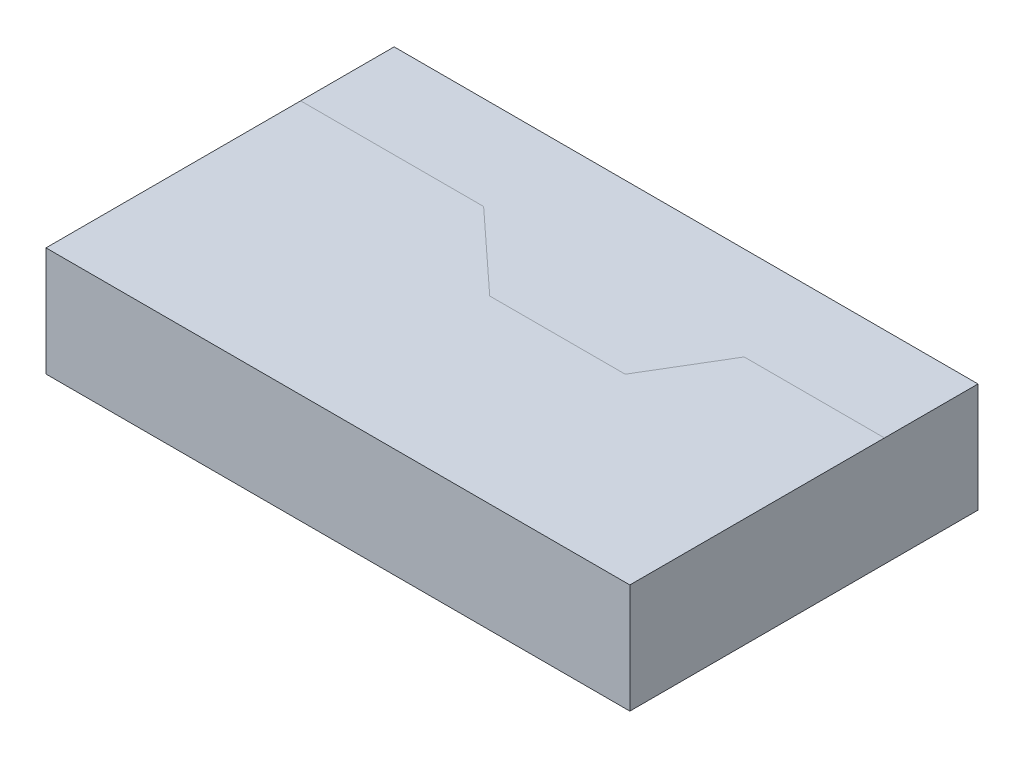
ISO-10303-21;
HEADER;
FILE_DESCRIPTION(('STEP AP214'),'2;1');
FILE_NAME('part.step','',(''),(''),'','','');
FILE_SCHEMA(('AUTOMOTIVE_DESIGN { 1 0 10303 214 1 1 1 1 }'));
ENDSEC;
DATA;
#1=APPLICATION_CONTEXT('core data for automotive mechanical design processes');
#2=APPLICATION_PROTOCOL_DEFINITION('international standard','automotive_design',2000,#1);
#3=PRODUCT_CONTEXT('',#1,'mechanical');
#4=PRODUCT('Part','Part','',(#3));
#5=PRODUCT_RELATED_PRODUCT_CATEGORY('part','',(#4));
#6=PRODUCT_DEFINITION_FORMATION('','',#4);
#7=PRODUCT_DEFINITION_CONTEXT('part definition',#1,'design');
#8=PRODUCT_DEFINITION('design','',#6,#7);
#9=PRODUCT_DEFINITION_SHAPE('','',#8);
#10=(LENGTH_UNIT() NAMED_UNIT(*) SI_UNIT(.MILLI.,.METRE.));
#11=(NAMED_UNIT(*) PLANE_ANGLE_UNIT() SI_UNIT($,.RADIAN.));
#12=(NAMED_UNIT(*) SI_UNIT($,.STERADIAN.) SOLID_ANGLE_UNIT());
#13=UNCERTAINTY_MEASURE_WITH_UNIT(LENGTH_MEASURE(1.E-05),#10,'distance_accuracy_value','');
#14=(GEOMETRIC_REPRESENTATION_CONTEXT(3) GLOBAL_UNCERTAINTY_ASSIGNED_CONTEXT((#13)) GLOBAL_UNIT_ASSIGNED_CONTEXT((#10,
#11,#12)) REPRESENTATION_CONTEXT('',''));
#15=CARTESIAN_POINT('',(0.,0.,0.));
#16=DIRECTION('',(0.,0.,1.));
#17=DIRECTION('',(1.,0.,0.));
#18=AXIS2_PLACEMENT_3D('',#15,#16,#17);
#19=CARTESIAN_POINT('',(0.,0.,-80.9010250569476));
#20=DIRECTION('',(0.,-1.,0.));
#21=DIRECTION('',(0.,0.,-1.));
#22=AXIS2_PLACEMENT_3D('',#19,#20,#21);
#23=PLANE('',#22);
#24=DIRECTION('',(1.,0.,0.));
#25=VECTOR('',#24,1.);
#26=CARTESIAN_POINT('',(0.,0.,-59.1702292609045));
#27=LINE('',#26,#25);
#28=CARTESIAN_POINT('',(0.,0.,-59.1702292609045));
#29=VERTEX_POINT('',#28);
#30=CARTESIAN_POINT('',(42.5239207695656,0.,-59.1702292609045));
#31=VERTEX_POINT('',#30);
#32=EDGE_CURVE('E11',#29,#31,#27,.T.);
#33=ORIENTED_EDGE('',*,*,#32,.F.);
#34=DIRECTION('',(0.,0.,1.));
#35=VECTOR('',#34,1.);
#36=CARTESIAN_POINT('',(0.,0.,0.));
#37=LINE('',#36,#35);
#38=CARTESIAN_POINT('',(0.,0.,0.));
#39=VERTEX_POINT('',#38);
#40=EDGE_CURVE('E123',#29,#39,#37,.T.);
#41=ORIENTED_EDGE('',*,*,#40,.T.);
#42=DIRECTION('',(1.,0.,0.));
#43=VECTOR('',#42,1.);
#44=CARTESIAN_POINT('',(0.,0.,0.));
#45=LINE('',#44,#43);
#46=CARTESIAN_POINT('',(135.676166338205,0.,0.));
#47=VERTEX_POINT('',#46);
#48=EDGE_CURVE('E94',#39,#47,#45,.T.);
#49=ORIENTED_EDGE('',*,*,#48,.T.);
#50=DIRECTION('',(0.,0.,-1.));
#51=VECTOR('',#50,1.);
#52=CARTESIAN_POINT('',(135.676166338205,0.,0.));
#53=LINE('',#52,#51);
#54=CARTESIAN_POINT('',(135.676166338205,0.,-59.1702292609045));
#55=VERTEX_POINT('',#54);
#56=EDGE_CURVE('E116',#47,#55,#53,.T.);
#57=ORIENTED_EDGE('',*,*,#56,.T.);
#58=DIRECTION('',(1.,0.,0.));
#59=VECTOR('',#58,1.);
#60=CARTESIAN_POINT('',(0.,0.,-59.1702292609045));
#61=LINE('',#60,#59);
#62=CARTESIAN_POINT('',(103.079368078262,0.,-59.1702292609045));
#63=VERTEX_POINT('',#62);
#64=EDGE_CURVE('E129',#63,#55,#61,.T.);
#65=ORIENTED_EDGE('',*,*,#64,.F.);
#66=DIRECTION('',(0.513461011624656,0.,-0.858112923537097));
#67=VECTOR('',#66,1.);
#68=CARTESIAN_POINT('',(85.4780478818783,0.,-29.754324275168));
#69=LINE('',#68,#67);
#70=CARTESIAN_POINT('',(92.726797461084,0.,-41.8686728869914));
#71=VERTEX_POINT('',#70);
#72=EDGE_CURVE('E136',#71,#63,#69,.T.);
#73=ORIENTED_EDGE('',*,*,#72,.F.);
#74=DIRECTION('',(1.,0.,0.));
#75=VECTOR('',#74,1.);
#76=CARTESIAN_POINT('',(0.,0.,-41.8686728869914));
#77=LINE('',#76,#75);
#78=CARTESIAN_POINT('',(61.2436375019962,0.,-41.8686728869914));
#79=VERTEX_POINT('',#78);
#80=EDGE_CURVE('E139',#79,#71,#77,.T.);
#81=ORIENTED_EDGE('',*,*,#80,.F.);
#82=DIRECTION('',(0.734376708125109,0.,0.678742109024722));
#83=VECTOR('',#82,1.);
#84=CARTESIAN_POINT('',(8.75861400379892,0.,-90.3775582413858));
#85=LINE('',#84,#83);
#86=EDGE_CURVE('E42',#31,#79,#85,.T.);
#87=ORIENTED_EDGE('',*,*,#86,.F.);
#88=EDGE_LOOP('',(#33,#41,#49,#57,#65,#73,#81,#87));
#89=FACE_BOUND('',#88,.T.);
#90=ADVANCED_FACE('F33',(#89),#23,.F.);
#91=CARTESIAN_POINT('',(0.,-25.4,0.));
#92=DIRECTION('',(-1.,0.,0.));
#93=DIRECTION('',(0.,0.,1.));
#94=AXIS2_PLACEMENT_3D('',#91,#92,#93);
#95=PLANE('',#94);
#96=CARTESIAN_POINT('',(0.,0.,-80.9010250569476));
#97=VERTEX_POINT('',#96);
#98=EDGE_CURVE('E121',#97,#29,#37,.T.);
#99=ORIENTED_EDGE('',*,*,#98,.F.);
#100=DIRECTION('',(0.,1.,0.));
#101=VECTOR('',#100,1.);
#102=CARTESIAN_POINT('',(0.,-25.4,-80.9010250569476));
#103=LINE('',#102,#101);
#104=CARTESIAN_POINT('',(0.,-25.4,-80.9010250569476));
#105=VERTEX_POINT('',#104);
#106=EDGE_CURVE('E112',#105,#97,#103,.T.);
#107=ORIENTED_EDGE('',*,*,#106,.F.);
#108=DIRECTION('',(0.,0.,1.));
#109=VECTOR('',#108,1.);
#110=CARTESIAN_POINT('',(0.,-25.4,0.));
#111=LINE('',#110,#109);
#112=CARTESIAN_POINT('',(0.,-25.4,0.));
#113=VERTEX_POINT('',#112);
#114=EDGE_CURVE('E106',#105,#113,#111,.T.);
#115=ORIENTED_EDGE('',*,*,#114,.T.);
#116=DIRECTION('',(0.,1.,0.));
#117=VECTOR('',#116,1.);
#118=CARTESIAN_POINT('',(0.,-25.4,0.));
#119=LINE('',#118,#117);
#120=EDGE_CURVE('E89',#113,#39,#119,.T.);
#121=ORIENTED_EDGE('',*,*,#120,.T.);
#122=ORIENTED_EDGE('',*,*,#40,.F.);
#123=EDGE_LOOP('',(#99,#107,#115,#121,#122));
#124=FACE_BOUND('',#123,.T.);
#125=ADVANCED_FACE('F35',(#124),#95,.T.);
#126=CARTESIAN_POINT('',(0.,-25.4,-80.9010250569476));
#127=DIRECTION('',(0.,0.,-1.));
#128=DIRECTION('',(-1.,0.,0.));
#129=AXIS2_PLACEMENT_3D('',#126,#127,#128);
#130=PLANE('',#129);
#131=DIRECTION('',(-1.,0.,0.));
#132=VECTOR('',#131,1.);
#133=CARTESIAN_POINT('',(0.,0.,-80.9010250569476));
#134=LINE('',#133,#132);
#135=CARTESIAN_POINT('',(135.676166338205,0.,-80.9010250569476));
#136=VERTEX_POINT('',#135);
#137=EDGE_CURVE('E113',#136,#97,#134,.T.);
#138=ORIENTED_EDGE('',*,*,#137,.F.);
#139=DIRECTION('',(0.,1.,0.));
#140=VECTOR('',#139,1.);
#141=CARTESIAN_POINT('',(135.676166338205,-25.4,-80.9010250569476));
#142=LINE('',#141,#140);
#143=CARTESIAN_POINT('',(135.676166338205,-25.4,-80.9010250569476));
#144=VERTEX_POINT('',#143);
#145=EDGE_CURVE('E130',#144,#136,#142,.T.);
#146=ORIENTED_EDGE('',*,*,#145,.F.);
#147=DIRECTION('',(-1.,0.,0.));
#148=VECTOR('',#147,1.);
#149=CARTESIAN_POINT('',(0.,-25.4,-80.9010250569476));
#150=LINE('',#149,#148);
#151=EDGE_CURVE('E99',#144,#105,#150,.T.);
#152=ORIENTED_EDGE('',*,*,#151,.T.);
#153=ORIENTED_EDGE('',*,*,#106,.T.);
#154=EDGE_LOOP('',(#138,#146,#152,#153));
#155=FACE_BOUND('',#154,.T.);
#156=ADVANCED_FACE('F162',(#155),#130,.T.);
#157=CARTESIAN_POINT('',(135.676166338205,-25.4,0.));
#158=DIRECTION('',(1.,0.,0.));
#159=DIRECTION('',(0.,0.,-1.));
#160=AXIS2_PLACEMENT_3D('',#157,#158,#159);
#161=PLANE('',#160);
#162=ORIENTED_EDGE('',*,*,#56,.F.);
#163=DIRECTION('',(0.,1.,0.));
#164=VECTOR('',#163,1.);
#165=CARTESIAN_POINT('',(135.676166338205,-25.4,0.));
#166=LINE('',#165,#164);
#167=CARTESIAN_POINT('',(135.676166338205,-25.4,0.));
#168=VERTEX_POINT('',#167);
#169=EDGE_CURVE('E98',#168,#47,#166,.T.);
#170=ORIENTED_EDGE('',*,*,#169,.F.);
#171=DIRECTION('',(0.,0.,-1.));
#172=VECTOR('',#171,1.);
#173=CARTESIAN_POINT('',(135.676166338205,-25.4,0.));
#174=LINE('',#173,#172);
#175=EDGE_CURVE('E109',#168,#144,#174,.T.);
#176=ORIENTED_EDGE('',*,*,#175,.T.);
#177=ORIENTED_EDGE('',*,*,#145,.T.);
#178=EDGE_CURVE('E125',#55,#136,#53,.T.);
#179=ORIENTED_EDGE('',*,*,#178,.F.);
#180=EDGE_LOOP('',(#162,#170,#176,#177,#179));
#181=FACE_BOUND('',#180,.T.);
#182=ADVANCED_FACE('F159',(#181),#161,.T.);
#183=CARTESIAN_POINT('',(0.,-25.4,0.));
#184=DIRECTION('',(0.,0.,1.));
#185=DIRECTION('',(1.,0.,0.));
#186=AXIS2_PLACEMENT_3D('',#183,#184,#185);
#187=PLANE('',#186);
#188=ORIENTED_EDGE('',*,*,#48,.F.);
#189=ORIENTED_EDGE('',*,*,#120,.F.);
#190=DIRECTION('',(1.,0.,0.));
#191=VECTOR('',#190,1.);
#192=CARTESIAN_POINT('',(0.,-25.4,0.));
#193=LINE('',#192,#191);
#194=EDGE_CURVE('E92',#113,#168,#193,.T.);
#195=ORIENTED_EDGE('',*,*,#194,.T.);
#196=ORIENTED_EDGE('',*,*,#169,.T.);
#197=EDGE_LOOP('',(#188,#189,#195,#196));
#198=FACE_BOUND('',#197,.T.);
#199=ADVANCED_FACE('F91',(#198),#187,.T.);
#200=CARTESIAN_POINT('',(0.,-25.4,-80.9010250569476));
#201=DIRECTION('',(0.,-1.,0.));
#202=DIRECTION('',(0.,0.,-1.));
#203=AXIS2_PLACEMENT_3D('',#200,#201,#202);
#204=PLANE('',#203);
#205=ORIENTED_EDGE('',*,*,#114,.F.);
#206=ORIENTED_EDGE('',*,*,#151,.F.);
#207=ORIENTED_EDGE('',*,*,#175,.F.);
#208=ORIENTED_EDGE('',*,*,#194,.F.);
#209=EDGE_LOOP('',(#205,#206,#207,#208));
#210=FACE_BOUND('',#209,.T.);
#211=ADVANCED_FACE('F104',(#210),#204,.T.);
#212=ORIENTED_EDGE('',*,*,#98,.T.);
#213=ORIENTED_EDGE('',*,*,#32,.T.);
#214=ORIENTED_EDGE('',*,*,#86,.T.);
#215=ORIENTED_EDGE('',*,*,#80,.T.);
#216=ORIENTED_EDGE('',*,*,#72,.T.);
#217=ORIENTED_EDGE('',*,*,#64,.T.);
#218=ORIENTED_EDGE('',*,*,#178,.T.);
#219=ORIENTED_EDGE('',*,*,#137,.T.);
#220=EDGE_LOOP('',(#212,#213,#214,#215,#216,#217,#218,#219));
#221=FACE_BOUND('',#220,.T.);
#222=ADVANCED_FACE('F153',(#221),#23,.F.);
#223=CLOSED_SHELL('',(#90,#125,#156,#182,#199,#211,#222));
#224=MANIFOLD_SOLID_BREP('B2',#223);
#225=ADVANCED_BREP_SHAPE_REPRESENTATION('',(#18,#224),#14);
#226=SHAPE_DEFINITION_REPRESENTATION(#9,#225);
ENDSEC;
END-ISO-10303-21;
